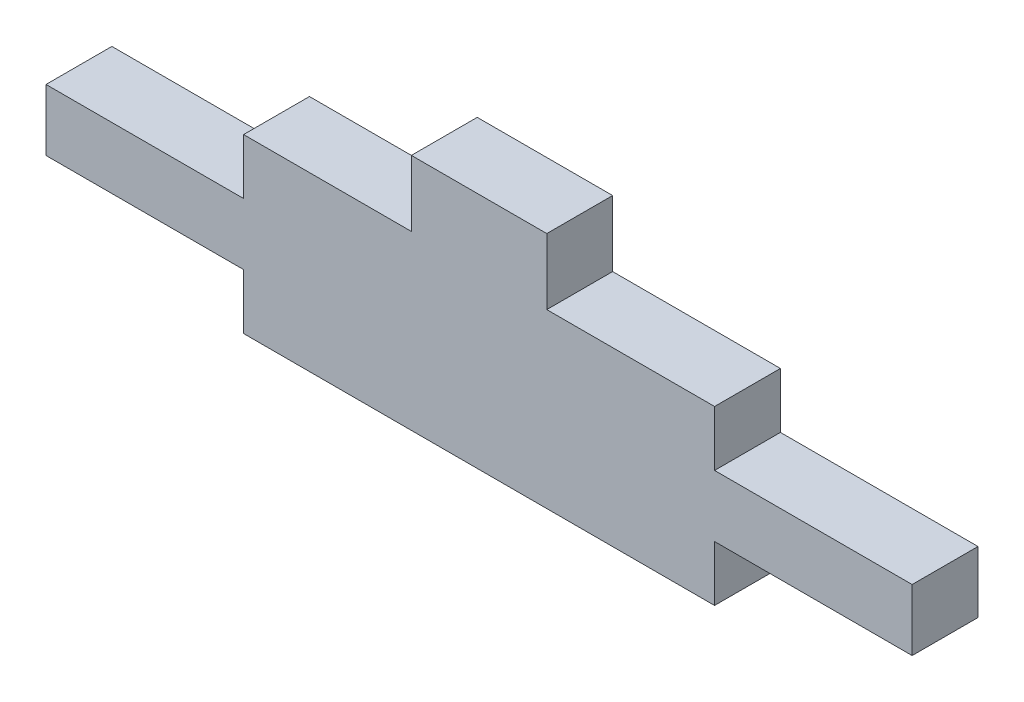
ISO-10303-21;
HEADER;
FILE_DESCRIPTION(('STEP AP214'),'2;1');
FILE_NAME('part.step','',(''),(''),'','','');
FILE_SCHEMA(('AUTOMOTIVE_DESIGN { 1 0 10303 214 1 1 1 1 }'));
ENDSEC;
DATA;
#1=APPLICATION_CONTEXT('core data for automotive mechanical design processes');
#2=APPLICATION_PROTOCOL_DEFINITION('international standard','automotive_design',2000,#1);
#3=PRODUCT_CONTEXT('',#1,'mechanical');
#4=PRODUCT('Part','Part','',(#3));
#5=PRODUCT_RELATED_PRODUCT_CATEGORY('part','',(#4));
#6=PRODUCT_DEFINITION_FORMATION('','',#4);
#7=PRODUCT_DEFINITION_CONTEXT('part definition',#1,'design');
#8=PRODUCT_DEFINITION('design','',#6,#7);
#9=PRODUCT_DEFINITION_SHAPE('','',#8);
#10=(LENGTH_UNIT() NAMED_UNIT(*) SI_UNIT(.MILLI.,.METRE.));
#11=(NAMED_UNIT(*) PLANE_ANGLE_UNIT() SI_UNIT($,.RADIAN.));
#12=(NAMED_UNIT(*) SI_UNIT($,.STERADIAN.) SOLID_ANGLE_UNIT());
#13=UNCERTAINTY_MEASURE_WITH_UNIT(LENGTH_MEASURE(1.E-05),#10,'distance_accuracy_value','');
#14=(GEOMETRIC_REPRESENTATION_CONTEXT(3) GLOBAL_UNCERTAINTY_ASSIGNED_CONTEXT((#13)) GLOBAL_UNIT_ASSIGNED_CONTEXT((#10,
#11,#12)) REPRESENTATION_CONTEXT('',''));
#15=CARTESIAN_POINT('',(0.,0.,0.));
#16=DIRECTION('',(0.,0.,1.));
#17=DIRECTION('',(1.,0.,0.));
#18=AXIS2_PLACEMENT_3D('',#15,#16,#17);
#19=CARTESIAN_POINT('',(-19.13,0.,5.35));
#20=DIRECTION('',(1.,0.,0.));
#21=DIRECTION('',(0.,0.,-1.));
#22=AXIS2_PLACEMENT_3D('',#19,#20,#21);
#23=PLANE('',#22);
#24=DIRECTION('',(0.,-1.,0.));
#25=VECTOR('',#24,1.);
#26=CARTESIAN_POINT('',(-19.13,0.,0.));
#27=LINE('',#26,#25);
#28=CARTESIAN_POINT('',(-19.13,4.5,0.));
#29=VERTEX_POINT('',#28);
#30=CARTESIAN_POINT('',(-19.13,0.,0.));
#31=VERTEX_POINT('',#30);
#32=EDGE_CURVE('E176',#29,#31,#27,.T.);
#33=ORIENTED_EDGE('',*,*,#32,.T.);
#34=DIRECTION('',(0.,0.,-1.));
#35=VECTOR('',#34,1.);
#36=CARTESIAN_POINT('',(-19.13,0.,5.35));
#37=LINE('',#36,#35);
#38=CARTESIAN_POINT('',(-19.13,0.,5.35));
#39=VERTEX_POINT('',#38);
#40=EDGE_CURVE('E11',#39,#31,#37,.T.);
#41=ORIENTED_EDGE('',*,*,#40,.F.);
#42=DIRECTION('',(0.,-1.,0.));
#43=VECTOR('',#42,1.);
#44=CARTESIAN_POINT('',(-19.13,0.,5.35));
#45=LINE('',#44,#43);
#46=CARTESIAN_POINT('',(-19.13,4.5,5.35));
#47=VERTEX_POINT('',#46);
#48=EDGE_CURVE('E206',#47,#39,#45,.T.);
#49=ORIENTED_EDGE('',*,*,#48,.F.);
#50=DIRECTION('',(0.,0.,-1.));
#51=VECTOR('',#50,1.);
#52=CARTESIAN_POINT('',(-19.13,4.5,5.35));
#53=LINE('',#52,#51);
#54=EDGE_CURVE('E172',#47,#29,#53,.T.);
#55=ORIENTED_EDGE('',*,*,#54,.T.);
#56=EDGE_LOOP('',(#33,#41,#49,#55));
#57=FACE_BOUND('',#56,.T.);
#58=ADVANCED_FACE('F32',(#57),#23,.F.);
#59=CARTESIAN_POINT('',(-19.13,0.,5.35));
#60=DIRECTION('',(0.,1.,0.));
#61=DIRECTION('',(0.,0.,1.));
#62=AXIS2_PLACEMENT_3D('',#59,#60,#61);
#63=PLANE('',#62);
#64=DIRECTION('',(1.,0.,0.));
#65=VECTOR('',#64,1.);
#66=CARTESIAN_POINT('',(-19.13,0.,0.));
#67=LINE('',#66,#65);
#68=CARTESIAN_POINT('',(19.13,0.,0.));
#69=VERTEX_POINT('',#68);
#70=EDGE_CURVE('E179',#31,#69,#67,.T.);
#71=ORIENTED_EDGE('',*,*,#70,.T.);
#72=DIRECTION('',(0.,0.,-1.));
#73=VECTOR('',#72,1.);
#74=CARTESIAN_POINT('',(19.13,0.,5.35));
#75=LINE('',#74,#73);
#76=CARTESIAN_POINT('',(19.13,0.,5.35));
#77=VERTEX_POINT('',#76);
#78=EDGE_CURVE('E40',#77,#69,#75,.T.);
#79=ORIENTED_EDGE('',*,*,#78,.F.);
#80=DIRECTION('',(1.,0.,0.));
#81=VECTOR('',#80,1.);
#82=CARTESIAN_POINT('',(-19.13,0.,5.35));
#83=LINE('',#82,#81);
#84=EDGE_CURVE('E115',#39,#77,#83,.T.);
#85=ORIENTED_EDGE('',*,*,#84,.F.);
#86=ORIENTED_EDGE('',*,*,#40,.T.);
#87=EDGE_LOOP('',(#71,#79,#85,#86));
#88=FACE_BOUND('',#87,.T.);
#89=ADVANCED_FACE('F304',(#88),#63,.F.);
#90=CARTESIAN_POINT('',(19.13,0.,5.35));
#91=DIRECTION('',(-1.,0.,0.));
#92=DIRECTION('',(0.,0.,1.));
#93=AXIS2_PLACEMENT_3D('',#90,#91,#92);
#94=PLANE('',#93);
#95=DIRECTION('',(0.,1.,0.));
#96=VECTOR('',#95,1.);
#97=CARTESIAN_POINT('',(19.13,0.,0.));
#98=LINE('',#97,#96);
#99=CARTESIAN_POINT('',(19.13,4.5,0.));
#100=VERTEX_POINT('',#99);
#101=EDGE_CURVE('E181',#69,#100,#98,.T.);
#102=ORIENTED_EDGE('',*,*,#101,.T.);
#103=DIRECTION('',(0.,0.,-1.));
#104=VECTOR('',#103,1.);
#105=CARTESIAN_POINT('',(19.13,4.5,5.35));
#106=LINE('',#105,#104);
#107=CARTESIAN_POINT('',(19.13,4.5,5.35));
#108=VERTEX_POINT('',#107);
#109=EDGE_CURVE('E237',#108,#100,#106,.T.);
#110=ORIENTED_EDGE('',*,*,#109,.F.);
#111=DIRECTION('',(0.,1.,0.));
#112=VECTOR('',#111,1.);
#113=CARTESIAN_POINT('',(19.13,0.,5.35));
#114=LINE('',#113,#112);
#115=EDGE_CURVE('E245',#77,#108,#114,.T.);
#116=ORIENTED_EDGE('',*,*,#115,.F.);
#117=ORIENTED_EDGE('',*,*,#78,.T.);
#118=EDGE_LOOP('',(#102,#110,#116,#117));
#119=FACE_BOUND('',#118,.T.);
#120=ADVANCED_FACE('F243',(#119),#94,.F.);
#121=CARTESIAN_POINT('',(19.13,4.5,5.35));
#122=DIRECTION('',(0.,1.,0.));
#123=DIRECTION('',(0.,0.,1.));
#124=AXIS2_PLACEMENT_3D('',#121,#122,#123);
#125=PLANE('',#124);
#126=DIRECTION('',(1.,0.,0.));
#127=VECTOR('',#126,1.);
#128=CARTESIAN_POINT('',(19.13,4.5,0.));
#129=LINE('',#128,#127);
#130=CARTESIAN_POINT('',(35.18,4.5,0.));
#131=VERTEX_POINT('',#130);
#132=EDGE_CURVE('E183',#100,#131,#129,.T.);
#133=ORIENTED_EDGE('',*,*,#132,.T.);
#134=DIRECTION('',(0.,0.,-1.));
#135=VECTOR('',#134,1.);
#136=CARTESIAN_POINT('',(35.18,4.5,5.35));
#137=LINE('',#136,#135);
#138=CARTESIAN_POINT('',(35.18,4.5,5.35));
#139=VERTEX_POINT('',#138);
#140=EDGE_CURVE('E234',#139,#131,#137,.T.);
#141=ORIENTED_EDGE('',*,*,#140,.F.);
#142=DIRECTION('',(1.,0.,0.));
#143=VECTOR('',#142,1.);
#144=CARTESIAN_POINT('',(19.13,4.5,5.35));
#145=LINE('',#144,#143);
#146=EDGE_CURVE('E263',#108,#139,#145,.T.);
#147=ORIENTED_EDGE('',*,*,#146,.F.);
#148=ORIENTED_EDGE('',*,*,#109,.T.);
#149=EDGE_LOOP('',(#133,#141,#147,#148));
#150=FACE_BOUND('',#149,.T.);
#151=ADVANCED_FACE('F254',(#150),#125,.F.);
#152=CARTESIAN_POINT('',(35.18,9.5,5.35));
#153=DIRECTION('',(-1.,0.,0.));
#154=DIRECTION('',(0.,0.,1.));
#155=AXIS2_PLACEMENT_3D('',#152,#153,#154);
#156=PLANE('',#155);
#157=DIRECTION('',(0.,1.,0.));
#158=VECTOR('',#157,1.);
#159=CARTESIAN_POINT('',(35.18,9.5,0.));
#160=LINE('',#159,#158);
#161=CARTESIAN_POINT('',(35.18,9.5,0.));
#162=VERTEX_POINT('',#161);
#163=EDGE_CURVE('E185',#131,#162,#160,.T.);
#164=ORIENTED_EDGE('',*,*,#163,.T.);
#165=DIRECTION('',(0.,0.,-1.));
#166=VECTOR('',#165,1.);
#167=CARTESIAN_POINT('',(35.18,9.5,5.35));
#168=LINE('',#167,#166);
#169=CARTESIAN_POINT('',(35.18,9.5,5.35));
#170=VERTEX_POINT('',#169);
#171=EDGE_CURVE('E231',#170,#162,#168,.T.);
#172=ORIENTED_EDGE('',*,*,#171,.F.);
#173=DIRECTION('',(0.,1.,0.));
#174=VECTOR('',#173,1.);
#175=CARTESIAN_POINT('',(35.18,9.5,5.35));
#176=LINE('',#175,#174);
#177=EDGE_CURVE('E260',#139,#170,#176,.T.);
#178=ORIENTED_EDGE('',*,*,#177,.F.);
#179=ORIENTED_EDGE('',*,*,#140,.T.);
#180=EDGE_LOOP('',(#164,#172,#178,#179));
#181=FACE_BOUND('',#180,.T.);
#182=ADVANCED_FACE('F258',(#181),#156,.F.);
#183=CARTESIAN_POINT('',(19.13,9.5,5.35));
#184=DIRECTION('',(0.,-1.,0.));
#185=DIRECTION('',(1.,0.,0.));
#186=AXIS2_PLACEMENT_3D('',#183,#184,#185);
#187=PLANE('',#186);
#188=DIRECTION('',(-1.,0.,0.));
#189=VECTOR('',#188,1.);
#190=CARTESIAN_POINT('',(19.13,9.5,0.));
#191=LINE('',#190,#189);
#192=CARTESIAN_POINT('',(19.13,9.5,0.));
#193=VERTEX_POINT('',#192);
#194=EDGE_CURVE('E187',#162,#193,#191,.T.);
#195=ORIENTED_EDGE('',*,*,#194,.T.);
#196=DIRECTION('',(0.,0.,-1.));
#197=VECTOR('',#196,1.);
#198=CARTESIAN_POINT('',(19.13,9.5,5.35));
#199=LINE('',#198,#197);
#200=CARTESIAN_POINT('',(19.13,9.5,5.35));
#201=VERTEX_POINT('',#200);
#202=EDGE_CURVE('E228',#201,#193,#199,.T.);
#203=ORIENTED_EDGE('',*,*,#202,.F.);
#204=DIRECTION('',(-1.,0.,0.));
#205=VECTOR('',#204,1.);
#206=CARTESIAN_POINT('',(19.13,9.5,5.35));
#207=LINE('',#206,#205);
#208=EDGE_CURVE('E262',#170,#201,#207,.T.);
#209=ORIENTED_EDGE('',*,*,#208,.F.);
#210=ORIENTED_EDGE('',*,*,#171,.T.);
#211=EDGE_LOOP('',(#195,#203,#209,#210));
#212=FACE_BOUND('',#211,.T.);
#213=ADVANCED_FACE('F317',(#212),#187,.F.);
#214=CARTESIAN_POINT('',(19.13,9.5,5.35));
#215=DIRECTION('',(-1.,0.,0.));
#216=DIRECTION('',(0.,-1.,0.));
#217=AXIS2_PLACEMENT_3D('',#214,#215,#216);
#218=PLANE('',#217);
#219=DIRECTION('',(0.,1.,0.));
#220=VECTOR('',#219,1.);
#221=CARTESIAN_POINT('',(19.13,9.5,0.));
#222=LINE('',#221,#220);
#223=CARTESIAN_POINT('',(19.13,14.,0.));
#224=VERTEX_POINT('',#223);
#225=EDGE_CURVE('E189',#193,#224,#222,.T.);
#226=ORIENTED_EDGE('',*,*,#225,.T.);
#227=DIRECTION('',(0.,0.,-1.));
#228=VECTOR('',#227,1.);
#229=CARTESIAN_POINT('',(19.13,14.,5.35));
#230=LINE('',#229,#228);
#231=CARTESIAN_POINT('',(19.13,14.,5.35));
#232=VERTEX_POINT('',#231);
#233=EDGE_CURVE('E225',#232,#224,#230,.T.);
#234=ORIENTED_EDGE('',*,*,#233,.F.);
#235=DIRECTION('',(0.,1.,0.));
#236=VECTOR('',#235,1.);
#237=CARTESIAN_POINT('',(19.13,9.5,5.35));
#238=LINE('',#237,#236);
#239=EDGE_CURVE('E265',#201,#232,#238,.T.);
#240=ORIENTED_EDGE('',*,*,#239,.F.);
#241=ORIENTED_EDGE('',*,*,#202,.T.);
#242=EDGE_LOOP('',(#226,#234,#240,#241));
#243=FACE_BOUND('',#242,.T.);
#244=ADVANCED_FACE('F320',(#243),#218,.F.);
#245=CARTESIAN_POINT('',(5.5,14.,5.35));
#246=DIRECTION('',(0.,-1.,0.));
#247=DIRECTION('',(0.,0.,-1.));
#248=AXIS2_PLACEMENT_3D('',#245,#246,#247);
#249=PLANE('',#248);
#250=DIRECTION('',(-1.,0.,0.));
#251=VECTOR('',#250,1.);
#252=CARTESIAN_POINT('',(5.5,14.,0.));
#253=LINE('',#252,#251);
#254=CARTESIAN_POINT('',(5.5,14.,0.));
#255=VERTEX_POINT('',#254);
#256=EDGE_CURVE('E191',#224,#255,#253,.T.);
#257=ORIENTED_EDGE('',*,*,#256,.T.);
#258=DIRECTION('',(0.,0.,-1.));
#259=VECTOR('',#258,1.);
#260=CARTESIAN_POINT('',(5.5,14.,5.35));
#261=LINE('',#260,#259);
#262=CARTESIAN_POINT('',(5.5,14.,5.35));
#263=VERTEX_POINT('',#262);
#264=EDGE_CURVE('E222',#263,#255,#261,.T.);
#265=ORIENTED_EDGE('',*,*,#264,.F.);
#266=DIRECTION('',(-1.,0.,0.));
#267=VECTOR('',#266,1.);
#268=CARTESIAN_POINT('',(5.5,14.,5.35));
#269=LINE('',#268,#267);
#270=EDGE_CURVE('E271',#232,#263,#269,.T.);
#271=ORIENTED_EDGE('',*,*,#270,.F.);
#272=ORIENTED_EDGE('',*,*,#233,.T.);
#273=EDGE_LOOP('',(#257,#265,#271,#272));
#274=FACE_BOUND('',#273,.T.);
#275=ADVANCED_FACE('F324',(#274),#249,.F.);
#276=CARTESIAN_POINT('',(5.5,14.,5.35));
#277=DIRECTION('',(-1.,0.,0.));
#278=DIRECTION('',(0.,-1.,0.));
#279=AXIS2_PLACEMENT_3D('',#276,#277,#278);
#280=PLANE('',#279);
#281=DIRECTION('',(0.,1.,0.));
#282=VECTOR('',#281,1.);
#283=CARTESIAN_POINT('',(5.5,14.,0.));
#284=LINE('',#283,#282);
#285=CARTESIAN_POINT('',(5.5,19.35,0.));
#286=VERTEX_POINT('',#285);
#287=EDGE_CURVE('E193',#255,#286,#284,.T.);
#288=ORIENTED_EDGE('',*,*,#287,.T.);
#289=DIRECTION('',(0.,0.,-1.));
#290=VECTOR('',#289,1.);
#291=CARTESIAN_POINT('',(5.5,19.35,5.35));
#292=LINE('',#291,#290);
#293=CARTESIAN_POINT('',(5.5,19.35,5.35));
#294=VERTEX_POINT('',#293);
#295=EDGE_CURVE('E219',#294,#286,#292,.T.);
#296=ORIENTED_EDGE('',*,*,#295,.F.);
#297=DIRECTION('',(0.,1.,0.));
#298=VECTOR('',#297,1.);
#299=CARTESIAN_POINT('',(5.5,14.,5.35));
#300=LINE('',#299,#298);
#301=EDGE_CURVE('E273',#263,#294,#300,.T.);
#302=ORIENTED_EDGE('',*,*,#301,.F.);
#303=ORIENTED_EDGE('',*,*,#264,.T.);
#304=EDGE_LOOP('',(#288,#296,#302,#303));
#305=FACE_BOUND('',#304,.T.);
#306=ADVANCED_FACE('F328',(#305),#280,.F.);
#307=CARTESIAN_POINT('',(-5.5,19.35,5.35));
#308=DIRECTION('',(0.,-1.,0.));
#309=DIRECTION('',(1.,0.,0.));
#310=AXIS2_PLACEMENT_3D('',#307,#308,#309);
#311=PLANE('',#310);
#312=DIRECTION('',(-1.,0.,0.));
#313=VECTOR('',#312,1.);
#314=CARTESIAN_POINT('',(-5.5,19.35,0.));
#315=LINE('',#314,#313);
#316=CARTESIAN_POINT('',(-5.5,19.35,0.));
#317=VERTEX_POINT('',#316);
#318=EDGE_CURVE('E195',#286,#317,#315,.T.);
#319=ORIENTED_EDGE('',*,*,#318,.T.);
#320=DIRECTION('',(0.,0.,-1.));
#321=VECTOR('',#320,1.);
#322=CARTESIAN_POINT('',(-5.5,19.35,5.35));
#323=LINE('',#322,#321);
#324=CARTESIAN_POINT('',(-5.5,19.35,5.35));
#325=VERTEX_POINT('',#324);
#326=EDGE_CURVE('E216',#325,#317,#323,.T.);
#327=ORIENTED_EDGE('',*,*,#326,.F.);
#328=DIRECTION('',(-1.,0.,0.));
#329=VECTOR('',#328,1.);
#330=CARTESIAN_POINT('',(-5.5,19.35,5.35));
#331=LINE('',#330,#329);
#332=EDGE_CURVE('E275',#294,#325,#331,.T.);
#333=ORIENTED_EDGE('',*,*,#332,.F.);
#334=ORIENTED_EDGE('',*,*,#295,.T.);
#335=EDGE_LOOP('',(#319,#327,#333,#334));
#336=FACE_BOUND('',#335,.T.);
#337=ADVANCED_FACE('F332',(#336),#311,.F.);
#338=CARTESIAN_POINT('',(-5.5,14.,5.35));
#339=DIRECTION('',(1.,0.,0.));
#340=DIRECTION('',(0.,0.,-1.));
#341=AXIS2_PLACEMENT_3D('',#338,#339,#340);
#342=PLANE('',#341);
#343=DIRECTION('',(0.,-1.,0.));
#344=VECTOR('',#343,1.);
#345=CARTESIAN_POINT('',(-5.5,14.,0.));
#346=LINE('',#345,#344);
#347=CARTESIAN_POINT('',(-5.5,14.,0.));
#348=VERTEX_POINT('',#347);
#349=EDGE_CURVE('E197',#317,#348,#346,.T.);
#350=ORIENTED_EDGE('',*,*,#349,.T.);
#351=DIRECTION('',(0.,0.,-1.));
#352=VECTOR('',#351,1.);
#353=CARTESIAN_POINT('',(-5.5,14.,5.35));
#354=LINE('',#353,#352);
#355=CARTESIAN_POINT('',(-5.5,14.,5.35));
#356=VERTEX_POINT('',#355);
#357=EDGE_CURVE('E213',#356,#348,#354,.T.);
#358=ORIENTED_EDGE('',*,*,#357,.F.);
#359=DIRECTION('',(0.,-1.,0.));
#360=VECTOR('',#359,1.);
#361=CARTESIAN_POINT('',(-5.5,14.,5.35));
#362=LINE('',#361,#360);
#363=EDGE_CURVE('E277',#325,#356,#362,.T.);
#364=ORIENTED_EDGE('',*,*,#363,.F.);
#365=ORIENTED_EDGE('',*,*,#326,.T.);
#366=EDGE_LOOP('',(#350,#358,#364,#365));
#367=FACE_BOUND('',#366,.T.);
#368=ADVANCED_FACE('F336',(#367),#342,.F.);
#369=CARTESIAN_POINT('',(-19.13,14.,5.35));
#370=DIRECTION('',(0.,-1.,0.));
#371=DIRECTION('',(0.,0.,-1.));
#372=AXIS2_PLACEMENT_3D('',#369,#370,#371);
#373=PLANE('',#372);
#374=DIRECTION('',(-1.,0.,0.));
#375=VECTOR('',#374,1.);
#376=CARTESIAN_POINT('',(-19.13,14.,0.));
#377=LINE('',#376,#375);
#378=CARTESIAN_POINT('',(-19.13,14.,0.));
#379=VERTEX_POINT('',#378);
#380=EDGE_CURVE('E199',#348,#379,#377,.T.);
#381=ORIENTED_EDGE('',*,*,#380,.T.);
#382=DIRECTION('',(0.,0.,-1.));
#383=VECTOR('',#382,1.);
#384=CARTESIAN_POINT('',(-19.13,14.,5.35));
#385=LINE('',#384,#383);
#386=CARTESIAN_POINT('',(-19.13,14.,5.35));
#387=VERTEX_POINT('',#386);
#388=EDGE_CURVE('E210',#387,#379,#385,.T.);
#389=ORIENTED_EDGE('',*,*,#388,.F.);
#390=DIRECTION('',(-1.,0.,0.));
#391=VECTOR('',#390,1.);
#392=CARTESIAN_POINT('',(-19.13,14.,5.35));
#393=LINE('',#392,#391);
#394=EDGE_CURVE('E279',#356,#387,#393,.T.);
#395=ORIENTED_EDGE('',*,*,#394,.F.);
#396=ORIENTED_EDGE('',*,*,#357,.T.);
#397=EDGE_LOOP('',(#381,#389,#395,#396));
#398=FACE_BOUND('',#397,.T.);
#399=ADVANCED_FACE('F285',(#398),#373,.F.);
#400=CARTESIAN_POINT('',(-19.13,9.5,5.35));
#401=DIRECTION('',(1.,0.,0.));
#402=DIRECTION('',(0.,1.,0.));
#403=AXIS2_PLACEMENT_3D('',#400,#401,#402);
#404=PLANE('',#403);
#405=DIRECTION('',(0.,-1.,0.));
#406=VECTOR('',#405,1.);
#407=CARTESIAN_POINT('',(-19.13,9.5,0.));
#408=LINE('',#407,#406);
#409=CARTESIAN_POINT('',(-19.13,9.5,0.));
#410=VERTEX_POINT('',#409);
#411=EDGE_CURVE('E201',#379,#410,#408,.T.);
#412=ORIENTED_EDGE('',*,*,#411,.T.);
#413=DIRECTION('',(0.,0.,-1.));
#414=VECTOR('',#413,1.);
#415=CARTESIAN_POINT('',(-19.13,9.5,5.35));
#416=LINE('',#415,#414);
#417=CARTESIAN_POINT('',(-19.13,9.5,5.35));
#418=VERTEX_POINT('',#417);
#419=EDGE_CURVE('E167',#418,#410,#416,.T.);
#420=ORIENTED_EDGE('',*,*,#419,.F.);
#421=DIRECTION('',(0.,-1.,0.));
#422=VECTOR('',#421,1.);
#423=CARTESIAN_POINT('',(-19.13,9.5,5.35));
#424=LINE('',#423,#422);
#425=EDGE_CURVE('E158',#387,#418,#424,.T.);
#426=ORIENTED_EDGE('',*,*,#425,.F.);
#427=ORIENTED_EDGE('',*,*,#388,.T.);
#428=EDGE_LOOP('',(#412,#420,#426,#427));
#429=FACE_BOUND('',#428,.T.);
#430=ADVANCED_FACE('F289',(#429),#404,.F.);
#431=CARTESIAN_POINT('',(-19.13,9.5,5.35));
#432=DIRECTION('',(0.,-1.,0.));
#433=DIRECTION('',(1.,0.,0.));
#434=AXIS2_PLACEMENT_3D('',#431,#432,#433);
#435=PLANE('',#434);
#436=DIRECTION('',(-1.,0.,0.));
#437=VECTOR('',#436,1.);
#438=CARTESIAN_POINT('',(-19.13,9.5,0.));
#439=LINE('',#438,#437);
#440=CARTESIAN_POINT('',(-35.18,9.5,0.));
#441=VERTEX_POINT('',#440);
#442=EDGE_CURVE('E166',#410,#441,#439,.T.);
#443=ORIENTED_EDGE('',*,*,#442,.T.);
#444=DIRECTION('',(0.,0.,-1.));
#445=VECTOR('',#444,1.);
#446=CARTESIAN_POINT('',(-35.18,9.5,5.35));
#447=LINE('',#446,#445);
#448=CARTESIAN_POINT('',(-35.18,9.5,5.35));
#449=VERTEX_POINT('',#448);
#450=EDGE_CURVE('E163',#449,#441,#447,.T.);
#451=ORIENTED_EDGE('',*,*,#450,.F.);
#452=DIRECTION('',(-1.,0.,0.));
#453=VECTOR('',#452,1.);
#454=CARTESIAN_POINT('',(-19.13,9.5,5.35));
#455=LINE('',#454,#453);
#456=EDGE_CURVE('E152',#418,#449,#455,.T.);
#457=ORIENTED_EDGE('',*,*,#456,.F.);
#458=ORIENTED_EDGE('',*,*,#419,.T.);
#459=EDGE_LOOP('',(#443,#451,#457,#458));
#460=FACE_BOUND('',#459,.T.);
#461=ADVANCED_FACE('F164',(#460),#435,.F.);
#462=CARTESIAN_POINT('',(-35.18,9.5,5.35));
#463=DIRECTION('',(1.,0.,0.));
#464=DIRECTION('',(0.,0.,-1.));
#465=AXIS2_PLACEMENT_3D('',#462,#463,#464);
#466=PLANE('',#465);
#467=DIRECTION('',(0.,-1.,0.));
#468=VECTOR('',#467,1.);
#469=CARTESIAN_POINT('',(-35.18,9.5,0.));
#470=LINE('',#469,#468);
#471=CARTESIAN_POINT('',(-35.18,4.5,0.));
#472=VERTEX_POINT('',#471);
#473=EDGE_CURVE('E101',#441,#472,#470,.T.);
#474=ORIENTED_EDGE('',*,*,#473,.T.);
#475=DIRECTION('',(0.,0.,-1.));
#476=VECTOR('',#475,1.);
#477=CARTESIAN_POINT('',(-35.18,4.5,5.35));
#478=LINE('',#477,#476);
#479=CARTESIAN_POINT('',(-35.18,4.5,5.35));
#480=VERTEX_POINT('',#479);
#481=EDGE_CURVE('E168',#480,#472,#478,.T.);
#482=ORIENTED_EDGE('',*,*,#481,.F.);
#483=DIRECTION('',(0.,-1.,0.));
#484=VECTOR('',#483,1.);
#485=CARTESIAN_POINT('',(-35.18,9.5,5.35));
#486=LINE('',#485,#484);
#487=EDGE_CURVE('E156',#449,#480,#486,.T.);
#488=ORIENTED_EDGE('',*,*,#487,.F.);
#489=ORIENTED_EDGE('',*,*,#450,.T.);
#490=EDGE_LOOP('',(#474,#482,#488,#489));
#491=FACE_BOUND('',#490,.T.);
#492=ADVANCED_FACE('F170',(#491),#466,.F.);
#493=CARTESIAN_POINT('',(-19.13,4.5,5.35));
#494=DIRECTION('',(0.,1.,0.));
#495=DIRECTION('',(0.,0.,1.));
#496=AXIS2_PLACEMENT_3D('',#493,#494,#495);
#497=PLANE('',#496);
#498=DIRECTION('',(1.,0.,0.));
#499=VECTOR('',#498,1.);
#500=CARTESIAN_POINT('',(-19.13,4.5,0.));
#501=LINE('',#500,#499);
#502=EDGE_CURVE('E107',#472,#29,#501,.T.);
#503=ORIENTED_EDGE('',*,*,#502,.T.);
#504=ORIENTED_EDGE('',*,*,#54,.F.);
#505=DIRECTION('',(1.,0.,0.));
#506=VECTOR('',#505,1.);
#507=CARTESIAN_POINT('',(-19.13,4.5,5.35));
#508=LINE('',#507,#506);
#509=EDGE_CURVE('E48',#480,#47,#508,.T.);
#510=ORIENTED_EDGE('',*,*,#509,.F.);
#511=ORIENTED_EDGE('',*,*,#481,.T.);
#512=EDGE_LOOP('',(#503,#504,#510,#511));
#513=FACE_BOUND('',#512,.T.);
#514=ADVANCED_FACE('F293',(#513),#497,.F.);
#515=CARTESIAN_POINT('',(0.,0.,5.35));
#516=DIRECTION('',(0.,0.,1.));
#517=DIRECTION('',(1.,0.,0.));
#518=AXIS2_PLACEMENT_3D('',#515,#516,#517);
#519=PLANE('',#518);
#520=ORIENTED_EDGE('',*,*,#48,.T.);
#521=ORIENTED_EDGE('',*,*,#84,.T.);
#522=ORIENTED_EDGE('',*,*,#115,.T.);
#523=ORIENTED_EDGE('',*,*,#146,.T.);
#524=ORIENTED_EDGE('',*,*,#177,.T.);
#525=ORIENTED_EDGE('',*,*,#208,.T.);
#526=ORIENTED_EDGE('',*,*,#239,.T.);
#527=ORIENTED_EDGE('',*,*,#270,.T.);
#528=ORIENTED_EDGE('',*,*,#301,.T.);
#529=ORIENTED_EDGE('',*,*,#332,.T.);
#530=ORIENTED_EDGE('',*,*,#363,.T.);
#531=ORIENTED_EDGE('',*,*,#394,.T.);
#532=ORIENTED_EDGE('',*,*,#425,.T.);
#533=ORIENTED_EDGE('',*,*,#456,.T.);
#534=ORIENTED_EDGE('',*,*,#487,.T.);
#535=ORIENTED_EDGE('',*,*,#509,.T.);
#536=EDGE_LOOP('',(#520,#521,#522,#523,#524,#525,#526,#527,#528,#529,#530,#531,#532,#533,#534,#535));
#537=FACE_BOUND('',#536,.T.);
#538=ADVANCED_FACE('F154',(#537),#519,.T.);
#539=CARTESIAN_POINT('',(0.,0.,0.));
#540=DIRECTION('',(0.,0.,1.));
#541=DIRECTION('',(1.,0.,0.));
#542=AXIS2_PLACEMENT_3D('',#539,#540,#541);
#543=PLANE('',#542);
#544=ORIENTED_EDGE('',*,*,#32,.F.);
#545=ORIENTED_EDGE('',*,*,#502,.F.);
#546=ORIENTED_EDGE('',*,*,#473,.F.);
#547=ORIENTED_EDGE('',*,*,#442,.F.);
#548=ORIENTED_EDGE('',*,*,#411,.F.);
#549=ORIENTED_EDGE('',*,*,#380,.F.);
#550=ORIENTED_EDGE('',*,*,#349,.F.);
#551=ORIENTED_EDGE('',*,*,#318,.F.);
#552=ORIENTED_EDGE('',*,*,#287,.F.);
#553=ORIENTED_EDGE('',*,*,#256,.F.);
#554=ORIENTED_EDGE('',*,*,#225,.F.);
#555=ORIENTED_EDGE('',*,*,#194,.F.);
#556=ORIENTED_EDGE('',*,*,#163,.F.);
#557=ORIENTED_EDGE('',*,*,#132,.F.);
#558=ORIENTED_EDGE('',*,*,#101,.F.);
#559=ORIENTED_EDGE('',*,*,#70,.F.);
#560=EDGE_LOOP('',(#544,#545,#546,#547,#548,#549,#550,#551,#552,#553,#554,#555,#556,#557,#558,#559));
#561=FACE_BOUND('',#560,.T.);
#562=ADVANCED_FACE('F249',(#561),#543,.F.);
#563=CLOSED_SHELL('',(#58,#89,#120,#151,#182,#213,#244,#275,#306,#337,#368,#399,#430,#461,#492,
#514,#538,#562));
#564=MANIFOLD_SOLID_BREP('B2',#563);
#565=ADVANCED_BREP_SHAPE_REPRESENTATION('',(#18,#564),#14);
#566=SHAPE_DEFINITION_REPRESENTATION(#9,#565);
ENDSEC;
END-ISO-10303-21;
